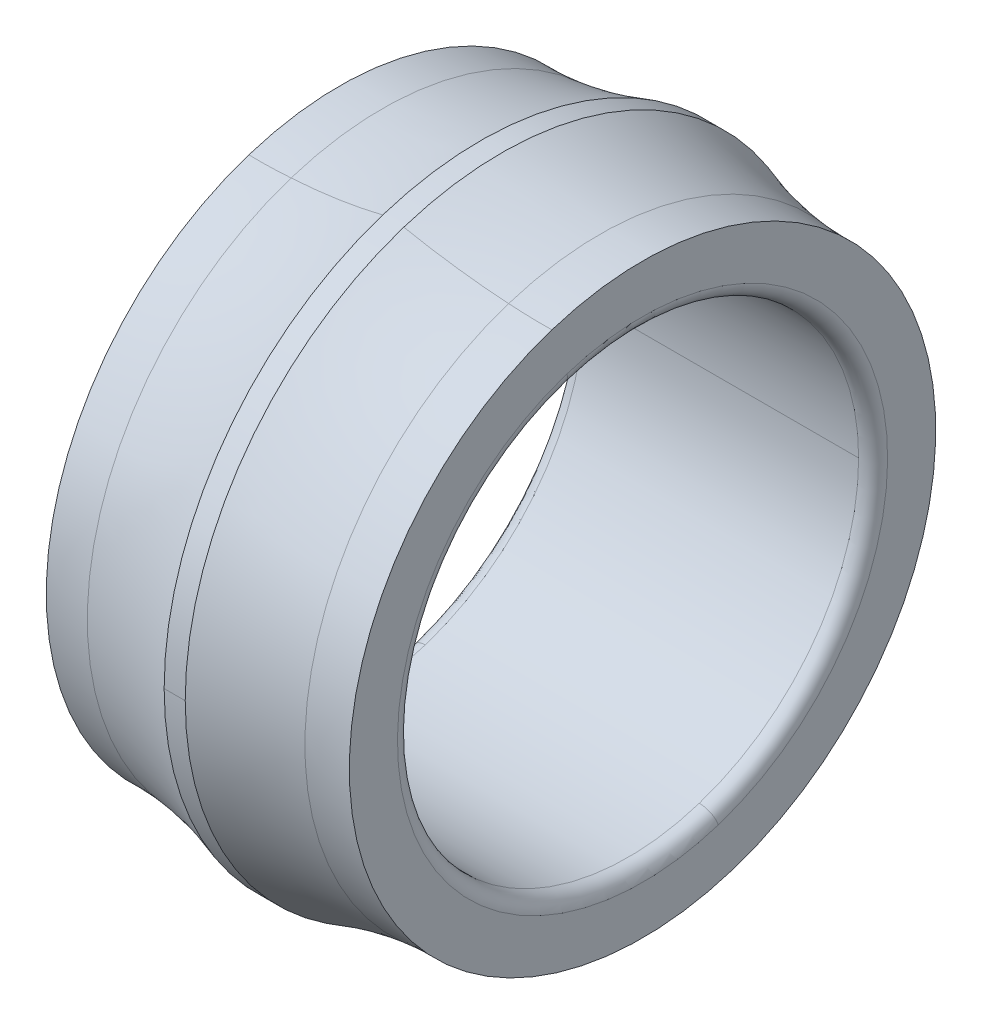
ISO-10303-21;
HEADER;
FILE_DESCRIPTION(('STEP AP214'),'2;1');
FILE_NAME('part.step','',(''),(''),'','','');
FILE_SCHEMA(('AUTOMOTIVE_DESIGN { 1 0 10303 214 1 1 1 1 }'));
ENDSEC;
DATA;
#1=APPLICATION_CONTEXT('core data for automotive mechanical design processes');
#2=APPLICATION_PROTOCOL_DEFINITION('international standard','automotive_design',2000,#1);
#3=PRODUCT_CONTEXT('',#1,'mechanical');
#4=PRODUCT('Part','Part','',(#3));
#5=PRODUCT_RELATED_PRODUCT_CATEGORY('part','',(#4));
#6=PRODUCT_DEFINITION_FORMATION('','',#4);
#7=PRODUCT_DEFINITION_CONTEXT('part definition',#1,'design');
#8=PRODUCT_DEFINITION('design','',#6,#7);
#9=PRODUCT_DEFINITION_SHAPE('','',#8);
#10=(LENGTH_UNIT() NAMED_UNIT(*) SI_UNIT(.MILLI.,.METRE.));
#11=(NAMED_UNIT(*) PLANE_ANGLE_UNIT() SI_UNIT($,.RADIAN.));
#12=(NAMED_UNIT(*) SI_UNIT($,.STERADIAN.) SOLID_ANGLE_UNIT());
#13=UNCERTAINTY_MEASURE_WITH_UNIT(LENGTH_MEASURE(1.E-05),#10,'distance_accuracy_value','');
#14=(GEOMETRIC_REPRESENTATION_CONTEXT(3) GLOBAL_UNCERTAINTY_ASSIGNED_CONTEXT((#13)) GLOBAL_UNIT_ASSIGNED_CONTEXT((#10,
#11,#12)) REPRESENTATION_CONTEXT('',''));
#15=CARTESIAN_POINT('',(0.,0.,0.));
#16=DIRECTION('',(0.,0.,1.));
#17=DIRECTION('',(1.,0.,0.));
#18=AXIS2_PLACEMENT_3D('',#15,#16,#17);
#19=CARTESIAN_POINT('',(0.,22.25,0.));
#20=DIRECTION('',(-1.,0.,0.));
#21=DIRECTION('',(0.,0.,1.));
#22=AXIS2_PLACEMENT_3D('',#19,#20,#21);
#23=PLANE('',#22);
#24=CARTESIAN_POINT('',(0.,0.,0.));
#25=DIRECTION('',(1.,0.,0.));
#26=DIRECTION('',(0.,0.,-1.));
#27=AXIS2_PLACEMENT_3D('',#24,#25,#26);
#28=CIRCLE('',#27,18.6);
#29=CARTESIAN_POINT('',(0.,17.6896512030902,5.74771609537413));
#30=VERTEX_POINT('',#29);
#31=CARTESIAN_POINT('',(0.,-17.6896512030902,-5.74771609537413));
#32=VERTEX_POINT('',#31);
#33=EDGE_CURVE('E11',#30,#32,#28,.T.);
#34=ORIENTED_EDGE('',*,*,#33,.T.);
#35=CARTESIAN_POINT('',(0.,-17.6896512030899,-5.74771609537402));
#36=CARTESIAN_POINT('',(0.,-16.7867653998321,-8.52637400922722));
#37=CARTESIAN_POINT('',(0.,-15.3385161051234,-11.1279192221512));
#38=CARTESIAN_POINT('',(0.,-13.3903241112692,-13.408836043617));
#39=CARTESIAN_POINT('',(0.,-8.70461316042848,-17.0837587172018));
#40=CARTESIAN_POINT('',(0.,-2.97734274849613,-18.7145319215939));
#41=CARTESIAN_POINT('',(0.,0.0130906277951703,-18.949889231922));
#42=CARTESIAN_POINT('',(0.,5.92494943547726,-18.2351193361642));
#43=CARTESIAN_POINT('',(0.,11.1278748827464,-15.338476908109));
#44=CARTESIAN_POINT('',(0.,13.408846748682,-13.3903362077559));
#45=CARTESIAN_POINT('',(0.,17.0837614039407,-8.70460788740662));
#46=CARTESIAN_POINT('',(0.,18.7145158430512,-2.97734119805316));
#47=CARTESIAN_POINT('',(0.,18.9499470050211,0.0130777958901866));
#48=CARTESIAN_POINT('',(0.,18.5924553872031,2.96903166185318));
#49=CARTESIAN_POINT('',(0.,17.6896512030899,5.74771609537402));
#50=B_SPLINE_CURVE_WITH_KNOTS('',5,(#35,#36,#37,#38,#39,#40,#41,#42,#43,#44,#45,#46,#47,#48,
#49),.UNSPECIFIED.,.F.,.F.,(6,3,3,3,6),(0.,0.785398163397448,1.5707963267949,2.35619449019234,
3.14159265358979),.UNSPECIFIED.);
#51=EDGE_CURVE('E25',#32,#30,#50,.T.);
#52=ORIENTED_EDGE('',*,*,#51,.T.);
#53=EDGE_LOOP('',(#34,#52));
#54=FACE_BOUND('',#53,.T.);
#55=CARTESIAN_POINT('',(0.,0.,0.));
#56=DIRECTION('',(1.,0.,0.));
#57=DIRECTION('',(0.,0.,-1.));
#58=AXIS2_PLACEMENT_3D('',#55,#56,#57);
#59=CIRCLE('',#58,22.25);
#60=CARTESIAN_POINT('',(0.,21.1610074875671,6.87562812484257));
#61=VERTEX_POINT('',#60);
#62=CARTESIAN_POINT('',(0.,-21.1610074875671,-6.87562812484257));
#63=VERTEX_POINT('',#62);
#64=EDGE_CURVE('E367',#61,#63,#59,.T.);
#65=ORIENTED_EDGE('',*,*,#64,.F.);
#66=CARTESIAN_POINT('',(0.,0.,0.));
#67=DIRECTION('',(1.,0.,0.));
#68=DIRECTION('',(0.,-0.951056516295154,-0.309016994374947));
#69=AXIS2_PLACEMENT_3D('',#66,#67,#68);
#70=CIRCLE('',#69,22.25);
#71=EDGE_CURVE('E362',#63,#61,#70,.T.);
#72=ORIENTED_EDGE('',*,*,#71,.F.);
#73=EDGE_LOOP('',(#65,#72));
#74=FACE_BOUND('',#73,.T.);
#75=ADVANCED_FACE('F16',(#54,#74),#23,.T.);
#76=CARTESIAN_POINT('',(0.707744054482949,0.,0.));
#77=DIRECTION('',(1.,0.,0.));
#78=DIRECTION('',(0.,-0.309016994374947,0.951056516295154));
#79=AXIS2_PLACEMENT_3D('',#76,#77,#78);
#80=TOROIDAL_SURFACE('',#79,45.2391082545753,22.9999999997226);
#81=CARTESIAN_POINT('',(0.707744054482949,-43.0249486968957,-13.9796532610317));
#82=DIRECTION('',(0.,0.309016994374947,-0.951056516295154));
#83=DIRECTION('',(-0.0307714806300624,0.95060613954749,0.308870658098906));
#84=AXIS2_PLACEMENT_3D('',#81,#82,#83);
#85=CIRCLE('',#84,22.9999999997226);
#86=CARTESIAN_POINT('',(3.24507491838244,-21.2841638454209,-6.91564405122555));
#87=VERTEX_POINT('',#86);
#88=EDGE_CURVE('E357',#63,#87,#85,.T.);
#89=ORIENTED_EDGE('',*,*,#88,.F.);
#90=ORIENTED_EDGE('',*,*,#71,.T.);
#91=CARTESIAN_POINT('',(0.707744054482949,43.0249486968957,13.9796532610317));
#92=DIRECTION('',(0.,-0.309016994374947,0.951056516295154));
#93=DIRECTION('',(-0.0307714806300629,-0.95060613954749,-0.308870658098906));
#94=AXIS2_PLACEMENT_3D('',#91,#92,#93);
#95=CIRCLE('',#94,22.9999999997226);
#96=CARTESIAN_POINT('',(3.24507491838244,21.2841638454209,6.91564405122556));
#97=VERTEX_POINT('',#96);
#98=EDGE_CURVE('E353',#61,#97,#95,.T.);
#99=ORIENTED_EDGE('',*,*,#98,.T.);
#100=CARTESIAN_POINT('',(3.24507491838238,0.,0.));
#101=DIRECTION('',(1.,0.,0.));
#102=DIRECTION('',(0.,-0.951056516295154,-0.309016994374947));
#103=AXIS2_PLACEMENT_3D('',#100,#101,#102);
#104=CIRCLE('',#103,22.379494257958);
#105=EDGE_CURVE('E348',#87,#97,#104,.T.);
#106=ORIENTED_EDGE('',*,*,#105,.F.);
#107=EDGE_LOOP('',(#89,#90,#99,#106));
#108=FACE_BOUND('',#107,.T.);
#109=ADVANCED_FACE('F388',(#108),#80,.F.);
#110=CARTESIAN_POINT('',(0.137967408664856,0.,0.));
#111=DIRECTION('',(1.,0.,0.));
#112=DIRECTION('',(0.,-0.309016994374947,0.951056516295154));
#113=AXIS2_PLACEMENT_3D('',#110,#111,#112);
#114=TOROIDAL_SURFACE('',#113,54.5392466384352,32.3095000000086);
#115=CARTESIAN_POINT('',(0.137967408664856,-51.8699059093124,-16.8535540716832));
#116=DIRECTION('',(0.,0.309016994374947,-0.951056516295154));
#117=DIRECTION('',(0.0961669945284438,0.946648572831004,0.307584766723564));
#118=AXIS2_PLACEMENT_3D('',#115,#116,#117);
#119=CIRCLE('',#118,32.3095000000086);
#120=CARTESIAN_POINT('',(10.7001661655771,-22.8300567005585,-7.41793508812548));
#121=VERTEX_POINT('',#120);
#122=EDGE_CURVE('E343',#87,#121,#119,.T.);
#123=ORIENTED_EDGE('',*,*,#122,.F.);
#124=ORIENTED_EDGE('',*,*,#105,.T.);
#125=CARTESIAN_POINT('',(0.137967408664856,51.8699059093124,16.8535540716832));
#126=DIRECTION('',(0.,-0.309016994374947,0.951056516295154));
#127=DIRECTION('',(0.0961669945284437,-0.946648572831004,-0.307584766723564));
#128=AXIS2_PLACEMENT_3D('',#125,#126,#127);
#129=CIRCLE('',#128,32.3095000000086);
#130=CARTESIAN_POINT('',(10.700166165577,22.8300567005585,7.41793508812548));
#131=VERTEX_POINT('',#130);
#132=EDGE_CURVE('E339',#97,#131,#129,.T.);
#133=ORIENTED_EDGE('',*,*,#132,.T.);
#134=CARTESIAN_POINT('',(10.700166165577,0.,0.));
#135=DIRECTION('',(1.,0.,0.));
#136=DIRECTION('',(0.,0.,-1.));
#137=AXIS2_PLACEMENT_3D('',#134,#135,#136);
#138=CIRCLE('',#137,24.004942197855);
#139=CARTESIAN_POINT('',(10.700166165577,0.,-24.004942197855));
#140=VERTEX_POINT('',#139);
#141=EDGE_CURVE('E334',#140,#131,#138,.T.);
#142=ORIENTED_EDGE('',*,*,#141,.F.);
#143=CARTESIAN_POINT('',(10.700166165577,0.,0.));
#144=DIRECTION('',(1.,0.,0.));
#145=DIRECTION('',(0.,0.,-1.));
#146=AXIS2_PLACEMENT_3D('',#143,#144,#145);
#147=CIRCLE('',#146,24.004942197855);
#148=EDGE_CURVE('E329',#121,#140,#147,.T.);
#149=ORIENTED_EDGE('',*,*,#148,.F.);
#150=EDGE_LOOP('',(#123,#124,#133,#142,#149));
#151=FACE_BOUND('',#150,.T.);
#152=ADVANCED_FACE('F391',(#151),#114,.F.);
#153=CARTESIAN_POINT('',(23.,0.,0.));
#154=DIRECTION('',(1.,0.,0.));
#155=DIRECTION('',(0.,1.,0.));
#156=AXIS2_PLACEMENT_3D('',#153,#154,#155);
#157=CYLINDRICAL_SURFACE('',#156,24.004942197855);
#158=DIRECTION('',(1.,0.,0.));
#159=VECTOR('',#158,1.);
#160=CARTESIAN_POINT('',(10.700166165577,0.,24.004942197855));
#161=LINE('',#160,#159);
#162=CARTESIAN_POINT('',(10.700166165577,0.,24.004942197855));
#163=VERTEX_POINT('',#162);
#164=CARTESIAN_POINT('',(12.299833834423,0.,24.004942197855));
#165=VERTEX_POINT('',#164);
#166=EDGE_CURVE('E324',#163,#165,#161,.T.);
#167=ORIENTED_EDGE('',*,*,#166,.F.);
#168=CARTESIAN_POINT('',(10.700166165577,0.,0.));
#169=DIRECTION('',(1.,0.,0.));
#170=DIRECTION('',(0.,0.,-1.));
#171=AXIS2_PLACEMENT_3D('',#168,#169,#170);
#172=CIRCLE('',#171,24.004942197855);
#173=EDGE_CURVE('E319',#163,#121,#172,.T.);
#174=ORIENTED_EDGE('',*,*,#173,.T.);
#175=ORIENTED_EDGE('',*,*,#148,.T.);
#176=DIRECTION('',(1.,0.,0.));
#177=VECTOR('',#176,1.);
#178=CARTESIAN_POINT('',(10.700166165577,0.,-24.004942197855));
#179=LINE('',#178,#177);
#180=CARTESIAN_POINT('',(12.299833834423,0.,-24.004942197855));
#181=VERTEX_POINT('',#180);
#182=EDGE_CURVE('E315',#140,#181,#179,.T.);
#183=ORIENTED_EDGE('',*,*,#182,.T.);
#184=CARTESIAN_POINT('',(12.299833834423,0.,0.));
#185=DIRECTION('',(1.,0.,0.));
#186=DIRECTION('',(0.,0.,-1.));
#187=AXIS2_PLACEMENT_3D('',#184,#185,#186);
#188=CIRCLE('',#187,24.004942197855);
#189=CARTESIAN_POINT('',(12.299833834423,-22.8300567005585,-7.41793508812548));
#190=VERTEX_POINT('',#189);
#191=EDGE_CURVE('E310',#190,#181,#188,.T.);
#192=ORIENTED_EDGE('',*,*,#191,.F.);
#193=CARTESIAN_POINT('',(12.299833834423,0.,0.));
#194=DIRECTION('',(1.,0.,0.));
#195=DIRECTION('',(0.,0.,-1.));
#196=AXIS2_PLACEMENT_3D('',#193,#194,#195);
#197=CIRCLE('',#196,24.004942197855);
#198=EDGE_CURVE('E305',#165,#190,#197,.T.);
#199=ORIENTED_EDGE('',*,*,#198,.F.);
#200=EDGE_LOOP('',(#167,#174,#175,#183,#192,#199));
#201=FACE_BOUND('',#200,.T.);
#202=ADVANCED_FACE('F402',(#201),#157,.T.);
#203=CARTESIAN_POINT('',(22.8620325913374,0.,0.));
#204=DIRECTION('',(1.,0.,0.));
#205=DIRECTION('',(0.,0.309016994374947,-0.951056516295154));
#206=AXIS2_PLACEMENT_3D('',#203,#204,#205);
#207=TOROIDAL_SURFACE('',#206,54.5392466384428,32.3095000000165);
#208=CARTESIAN_POINT('',(22.8620325913374,-51.8699059093196,-16.8535540716855));
#209=DIRECTION('',(0.,0.309016994374947,-0.951056516295154));
#210=DIRECTION('',(-0.326906908398737,0.898802185386536,0.292038533049265));
#211=AXIS2_PLACEMENT_3D('',#208,#209,#210);
#212=CIRCLE('',#211,32.3095000000165);
#213=CARTESIAN_POINT('',(19.754925081616,-21.2841638454209,-6.91564405122557));
#214=VERTEX_POINT('',#213);
#215=EDGE_CURVE('E301',#190,#214,#212,.T.);
#216=ORIENTED_EDGE('',*,*,#215,.T.);
#217=CARTESIAN_POINT('',(19.754925081616,0.,0.));
#218=DIRECTION('',(1.,0.,0.));
#219=DIRECTION('',(0.,0.,-1.));
#220=AXIS2_PLACEMENT_3D('',#217,#218,#219);
#221=CIRCLE('',#220,22.379494257958);
#222=CARTESIAN_POINT('',(19.754925081616,21.2841638454209,6.91564405122557));
#223=VERTEX_POINT('',#222);
#224=EDGE_CURVE('E296',#223,#214,#221,.T.);
#225=ORIENTED_EDGE('',*,*,#224,.F.);
#226=CARTESIAN_POINT('',(22.8620325913374,51.8699059093196,16.8535540716855));
#227=DIRECTION('',(0.,-0.309016994374947,0.951056516295154));
#228=DIRECTION('',(-0.326906908398739,-0.898802185386535,-0.292038533049265));
#229=AXIS2_PLACEMENT_3D('',#226,#227,#228);
#230=CIRCLE('',#229,32.3095000000165);
#231=CARTESIAN_POINT('',(12.299833834423,22.8300567005585,7.41793508812548));
#232=VERTEX_POINT('',#231);
#233=EDGE_CURVE('E291',#232,#223,#230,.T.);
#234=ORIENTED_EDGE('',*,*,#233,.F.);
#235=CARTESIAN_POINT('',(12.299833834423,0.,0.));
#236=DIRECTION('',(1.,0.,0.));
#237=DIRECTION('',(0.,0.,-1.));
#238=AXIS2_PLACEMENT_3D('',#235,#236,#237);
#239=CIRCLE('',#238,24.004942197855);
#240=EDGE_CURVE('E286',#232,#165,#239,.T.);
#241=ORIENTED_EDGE('',*,*,#240,.T.);
#242=ORIENTED_EDGE('',*,*,#198,.T.);
#243=EDGE_LOOP('',(#216,#225,#234,#241,#242));
#244=FACE_BOUND('',#243,.T.);
#245=ADVANCED_FACE('F405',(#244),#207,.F.);
#246=CARTESIAN_POINT('',(23.,0.,0.));
#247=DIRECTION('',(1.,0.,0.));
#248=DIRECTION('',(0.,-1.,0.));
#249=AXIS2_PLACEMENT_3D('',#246,#247,#248);
#250=CYLINDRICAL_SURFACE('',#249,24.004942197855);
#251=ORIENTED_EDGE('',*,*,#166,.T.);
#252=ORIENTED_EDGE('',*,*,#240,.F.);
#253=CARTESIAN_POINT('',(12.299833834423,0.,0.));
#254=DIRECTION('',(1.,0.,0.));
#255=DIRECTION('',(0.,0.,-1.));
#256=AXIS2_PLACEMENT_3D('',#253,#254,#255);
#257=CIRCLE('',#256,24.004942197855);
#258=EDGE_CURVE('E281',#181,#232,#257,.T.);
#259=ORIENTED_EDGE('',*,*,#258,.F.);
#260=ORIENTED_EDGE('',*,*,#182,.F.);
#261=ORIENTED_EDGE('',*,*,#141,.T.);
#262=CARTESIAN_POINT('',(10.700166165577,0.,0.));
#263=DIRECTION('',(1.,0.,0.));
#264=DIRECTION('',(0.,0.,-1.));
#265=AXIS2_PLACEMENT_3D('',#262,#263,#264);
#266=CIRCLE('',#265,24.004942197855);
#267=EDGE_CURVE('E276',#131,#163,#266,.T.);
#268=ORIENTED_EDGE('',*,*,#267,.T.);
#269=EDGE_LOOP('',(#251,#252,#259,#260,#261,#268));
#270=FACE_BOUND('',#269,.T.);
#271=ADVANCED_FACE('F399',(#270),#250,.T.);
#272=CARTESIAN_POINT('',(0.137967408664856,0.,0.));
#273=DIRECTION('',(1.,0.,0.));
#274=DIRECTION('',(0.,0.309016994374947,-0.951056516295154));
#275=AXIS2_PLACEMENT_3D('',#272,#273,#274);
#276=TOROIDAL_SURFACE('',#275,54.5392466384352,32.3095000000086);
#277=ORIENTED_EDGE('',*,*,#122,.T.);
#278=ORIENTED_EDGE('',*,*,#173,.F.);
#279=ORIENTED_EDGE('',*,*,#267,.F.);
#280=ORIENTED_EDGE('',*,*,#132,.F.);
#281=CARTESIAN_POINT('',(3.24507491838238,0.,0.));
#282=DIRECTION('',(1.,0.,0.));
#283=DIRECTION('',(0.,0.,-1.));
#284=AXIS2_PLACEMENT_3D('',#281,#282,#283);
#285=CIRCLE('',#284,22.379494257958);
#286=EDGE_CURVE('E271',#97,#87,#285,.T.);
#287=ORIENTED_EDGE('',*,*,#286,.T.);
#288=EDGE_LOOP('',(#277,#278,#279,#280,#287));
#289=FACE_BOUND('',#288,.T.);
#290=ADVANCED_FACE('F396',(#289),#276,.F.);
#291=CARTESIAN_POINT('',(0.707744054482949,0.,0.));
#292=DIRECTION('',(1.,0.,0.));
#293=DIRECTION('',(0.,0.309016994374947,-0.951056516295154));
#294=AXIS2_PLACEMENT_3D('',#291,#292,#293);
#295=TOROIDAL_SURFACE('',#294,45.2391082545753,22.9999999997226);
#296=ORIENTED_EDGE('',*,*,#88,.T.);
#297=ORIENTED_EDGE('',*,*,#286,.F.);
#298=ORIENTED_EDGE('',*,*,#98,.F.);
#299=ORIENTED_EDGE('',*,*,#64,.T.);
#300=EDGE_LOOP('',(#296,#297,#298,#299));
#301=FACE_BOUND('',#300,.T.);
#302=ADVANCED_FACE('F384',(#301),#295,.F.);
#303=CARTESIAN_POINT('',(22.8620325913374,0.,0.));
#304=DIRECTION('',(1.,0.,0.));
#305=DIRECTION('',(0.,-0.309016994374947,0.951056516295154));
#306=AXIS2_PLACEMENT_3D('',#303,#304,#305);
#307=TOROIDAL_SURFACE('',#306,54.5392466384428,32.3095000000165);
#308=ORIENTED_EDGE('',*,*,#215,.F.);
#309=ORIENTED_EDGE('',*,*,#191,.T.);
#310=ORIENTED_EDGE('',*,*,#258,.T.);
#311=ORIENTED_EDGE('',*,*,#233,.T.);
#312=CARTESIAN_POINT('',(19.754925081616,0.,0.));
#313=DIRECTION('',(1.,0.,0.));
#314=DIRECTION('',(0.,-0.951056516295154,-0.309016994374947));
#315=AXIS2_PLACEMENT_3D('',#312,#313,#314);
#316=CIRCLE('',#315,22.379494257958);
#317=EDGE_CURVE('E266',#214,#223,#316,.T.);
#318=ORIENTED_EDGE('',*,*,#317,.F.);
#319=EDGE_LOOP('',(#308,#309,#310,#311,#318));
#320=FACE_BOUND('',#319,.T.);
#321=ADVANCED_FACE('F409',(#320),#307,.F.);
#322=CARTESIAN_POINT('',(22.2922559455175,0.,0.));
#323=DIRECTION('',(1.,0.,0.));
#324=DIRECTION('',(0.,-0.309016994374947,0.951056516295154));
#325=AXIS2_PLACEMENT_3D('',#322,#323,#324);
#326=TOROIDAL_SURFACE('',#325,45.2391082546171,22.9999999997644);
#327=CARTESIAN_POINT('',(22.2922559455175,-43.0249486969355,-13.9796532610446));
#328=DIRECTION('',(0.,0.309016994374947,-0.951056516295154));
#329=DIRECTION('',(-0.110318733214235,0.945251515292926,0.307130835212672));
#330=AXIS2_PLACEMENT_3D('',#327,#328,#329);
#331=CIRCLE('',#330,22.9999999997643);
#332=CARTESIAN_POINT('',(23.,-21.1610074875672,-6.87562812484257));
#333=VERTEX_POINT('',#332);
#334=EDGE_CURVE('E261',#214,#333,#331,.T.);
#335=ORIENTED_EDGE('',*,*,#334,.F.);
#336=ORIENTED_EDGE('',*,*,#317,.T.);
#337=CARTESIAN_POINT('',(22.2922559455175,43.0249486969355,13.9796532610446));
#338=DIRECTION('',(0.,-0.309016994374947,0.951056516295154));
#339=DIRECTION('',(-0.110318733214236,-0.945251515292926,-0.307130835212672));
#340=AXIS2_PLACEMENT_3D('',#337,#338,#339);
#341=CIRCLE('',#340,22.9999999997644);
#342=CARTESIAN_POINT('',(23.,21.1610074875672,6.87562812484257));
#343=VERTEX_POINT('',#342);
#344=EDGE_CURVE('E257',#223,#343,#341,.T.);
#345=ORIENTED_EDGE('',*,*,#344,.T.);
#346=CARTESIAN_POINT('',(23.,0.,0.));
#347=DIRECTION('',(1.,0.,0.));
#348=DIRECTION('',(0.,-0.951056516295154,-0.309016994374947));
#349=AXIS2_PLACEMENT_3D('',#346,#347,#348);
#350=CIRCLE('',#349,22.25);
#351=EDGE_CURVE('E252',#333,#343,#350,.T.);
#352=ORIENTED_EDGE('',*,*,#351,.F.);
#353=EDGE_LOOP('',(#335,#336,#345,#352));
#354=FACE_BOUND('',#353,.T.);
#355=ADVANCED_FACE('F413',(#354),#326,.F.);
#356=CARTESIAN_POINT('',(23.,18.6,0.));
#357=DIRECTION('',(1.,0.,0.));
#358=DIRECTION('',(0.,0.,-1.));
#359=AXIS2_PLACEMENT_3D('',#356,#357,#358);
#360=PLANE('',#359);
#361=CARTESIAN_POINT('',(23.,0.,0.));
#362=DIRECTION('',(1.,0.,0.));
#363=DIRECTION('',(0.,0.,-1.));
#364=AXIS2_PLACEMENT_3D('',#361,#362,#363);
#365=CIRCLE('',#364,22.25);
#366=EDGE_CURVE('E249',#343,#333,#365,.T.);
#367=ORIENTED_EDGE('',*,*,#366,.T.);
#368=ORIENTED_EDGE('',*,*,#351,.T.);
#369=EDGE_LOOP('',(#367,#368));
#370=FACE_BOUND('',#369,.T.);
#371=CARTESIAN_POINT('',(23.,-17.6896512030905,-5.74771609537427));
#372=CARTESIAN_POINT('',(23.,-17.5956104633095,-6.0371646235953));
#373=CARTESIAN_POINT('',(23.,-17.4944537525369,-6.32430045508391));
#374=CARTESIAN_POINT('',(23.,-17.2781786114769,-6.89326507254812));
#375=CARTESIAN_POINT('',(23.,-17.1630601811896,-7.17509385852372));
#376=CARTESIAN_POINT('',(23.,-16.9191318235691,-7.73276273291374));
#377=CARTESIAN_POINT('',(23.,-16.790321896236,-8.00860282132817));
#378=CARTESIAN_POINT('',(23.,-16.5193227634808,-8.55363050161192));
#379=CARTESIAN_POINT('',(23.,-16.3771335580587,-8.82281809348125));
#380=CARTESIAN_POINT('',(23.,-16.0797179050506,-9.3538920902062));
#381=CARTESIAN_POINT('',(23.,-15.9244914574645,-9.6157784950618));
#382=CARTESIAN_POINT('',(23.,-15.6013754109782,-10.1316192624487));
#383=CARTESIAN_POINT('',(23.,-15.4334858120778,-10.38557362498));
#384=CARTESIAN_POINT('',(23.,-15.0854478870724,-10.884938495488));
#385=CARTESIAN_POINT('',(23.,-14.9052995609672,-11.1303490034646));
#386=CARTESIAN_POINT('',(23.,-14.5331781844664,-11.6120349531859));
#387=CARTESIAN_POINT('',(23.,-14.3412051340707,-11.8483103949305));
#388=CARTESIAN_POINT('',(23.,-13.9458967862515,-12.3111570029533));
#389=CARTESIAN_POINT('',(23.,-13.7425614888279,-12.5377281692315));
#390=CARTESIAN_POINT('',(23.,-13.3250185001993,-12.9806203968046));
#391=CARTESIAN_POINT('',(23.,-13.1108108089943,-13.1969414580995));
#392=CARTESIAN_POINT('',(23.,-12.6720390777044,-13.6188123392501));
#393=CARTESIAN_POINT('',(23.,-12.4474750376195,-13.8243621591057));
#394=CARTESIAN_POINT('',(23.,-11.9885316030626,-14.2241953698769));
#395=CARTESIAN_POINT('',(23.,-11.7541522085905,-14.4184787607924));
#396=CARTESIAN_POINT('',(23.,-11.2761427057362,-14.7953110679724));
#397=CARTESIAN_POINT('',(23.,-11.0325125973539,-14.9778599842367));
#398=CARTESIAN_POINT('',(23.,-10.5365885929532,-15.330783565787));
#399=CARTESIAN_POINT('',(23.,-10.2842946969349,-15.5011582310729));
#400=CARTESIAN_POINT('',(23.,-9.77165091535505,-15.8293228631741));
#401=CARTESIAN_POINT('',(23.,-9.51130102979354,-15.9871128299895));
#402=CARTESIAN_POINT('',(23.,-8.98317247480588,-16.2897279352988));
#403=CARTESIAN_POINT('',(23.,-8.71539380537973,-16.4345530737928));
#404=CARTESIAN_POINT('',(23.,-8.17305278493202,-16.7108896260157));
#405=CARTESIAN_POINT('',(23.,-7.89849043391046,-16.8424010397446));
#406=CARTESIAN_POINT('',(23.,-7.34324349502436,-17.0917933199225));
#407=CARTESIAN_POINT('',(23.,-7.06255890715983,-17.2096741863715));
#408=CARTESIAN_POINT('',(23.,-6.49574368834503,-17.4315213866573));
#409=CARTESIAN_POINT('',(23.,-6.20961305739476,-17.535487720494));
#410=CARTESIAN_POINT('',(23.,-5.63259506616053,-17.7292553915507));
#411=CARTESIAN_POINT('',(23.,-5.34170770587656,-17.8190567287706));
#412=CARTESIAN_POINT('',(23.,-4.75587702910458,-17.9842780673065));
#413=CARTESIAN_POINT('',(23.,-4.46093371261657,-18.0596980686225));
#414=CARTESIAN_POINT('',(23.,-3.86770166771989,-18.1959750419614));
#415=CARTESIAN_POINT('',(23.,-3.56941293931123,-18.2568320139843));
#416=CARTESIAN_POINT('',(23.,-2.97020867424701,-18.363836318961));
#417=CARTESIAN_POINT('',(23.,-2.66929313759145,-18.4099836519148));
#418=CARTESIAN_POINT('',(23.,-2.06556018791832,-18.4874575057862));
#419=CARTESIAN_POINT('',(23.,-1.76274277490074,-18.5187840267038));
#420=CARTESIAN_POINT('',(23.,-1.15593558617521,-18.56654078817));
#421=CARTESIAN_POINT('',(23.,-0.851945810467258,-18.5829710287185));
#422=CARTESIAN_POINT('',(23.,-0.243526234357017,-18.6008956475581));
#423=CARTESIAN_POINT('',(23.,0.060903566045269,-18.602390025849));
#424=CARTESIAN_POINT('',(23.,0.669469793490115,-18.5904393200852));
#425=CARTESIAN_POINT('',(23.,0.973606220532675,-18.5769942360303));
#426=CARTESIAN_POINT('',(23.,1.58085300996611,-18.53519699596));
#427=CARTESIAN_POINT('',(23.,1.88396337235698,-18.5068448399445));
#428=CARTESIAN_POINT('',(23.,2.48842781307471,-18.4353017587801));
#429=CARTESIAN_POINT('',(23.,2.78978189140157,-18.3921108336312));
#430=CARTESIAN_POINT('',(23.,3.3900077756211,-18.2909942649216));
#431=CARTESIAN_POINT('',(23.,3.68887958151376,-18.2330686213609));
#432=CARTESIAN_POINT('',(23.,4.2834209125064,-18.1026221637769));
#433=CARTESIAN_POINT('',(23.,4.57909043760638,-18.0301013497536));
#434=CARTESIAN_POINT('',(23.,5.16651491323011,-17.8706392602373));
#435=CARTESIAN_POINT('',(23.,5.45826986375385,-17.7836979847444));
#436=CARTESIAN_POINT('',(23.,6.03716232699458,-17.5956044214367));
#437=CARTESIAN_POINT('',(23.,6.32429983971157,-17.4944521336219));
#438=CARTESIAN_POINT('',(23.,6.89326568792037,-17.2781802303919));
#439=CARTESIAN_POINT('',(23.,7.17509402341218,-17.1630606149766));
#440=CARTESIAN_POINT('',(23.,7.73276256802519,-16.9191313897822));
#441=CARTESIAN_POINT('',(23.,8.00860277714638,-16.7903217800031));
#442=CARTESIAN_POINT('',(23.,8.55363054579362,-16.5193228797137));
#443=CARTESIAN_POINT('',(23.,8.82281810531967,-16.3771335892032));
#444=CARTESIAN_POINT('',(23.,9.35389207836769,-16.0797178739061));
#445=CARTESIAN_POINT('',(23.,9.61577849188966,-15.9244914491194));
#446=CARTESIAN_POINT('',(23.,10.1316192656208,-15.6013754193233));
#447=CARTESIAN_POINT('',(23.,10.38557362583,-15.4334858143139));
#448=CARTESIAN_POINT('',(23.,10.884938494638,-15.0854478848363));
#449=CARTESIAN_POINT('',(23.,11.1303490032368,-14.9052995603681));
#450=CARTESIAN_POINT('',(23.,11.6120349534136,-14.5331781850656));
#451=CARTESIAN_POINT('',(23.,11.8483103949915,-14.3412051342313));
#452=CARTESIAN_POINT('',(23.,12.3111570028922,-13.945896786091));
#453=CARTESIAN_POINT('',(23.,12.5377281692151,-13.7425614887849));
#454=CARTESIAN_POINT('',(23.,12.9806203968209,-13.3250185002423));
#455=CARTESIAN_POINT('',(23.,13.1969414581039,-13.1108108090058));
#456=CARTESIAN_POINT('',(23.,13.6188123392457,-12.6720390776929));
#457=CARTESIAN_POINT('',(23.,13.8243621591045,-12.4474750376164));
#458=CARTESIAN_POINT('',(23.,14.224195369878,-11.9885316030657));
#459=CARTESIAN_POINT('',(23.,14.4184787607927,-11.7541522085914));
#460=CARTESIAN_POINT('',(23.,14.795311067972,-11.2761427057354));
#461=CARTESIAN_POINT('',(23.,14.9778599842366,-11.0325125973537));
#462=CARTESIAN_POINT('',(23.,15.3307835657871,-10.5365885929535));
#463=CARTESIAN_POINT('',(23.,15.5011582310729,-10.284294696935));
#464=CARTESIAN_POINT('',(23.,15.8293228631741,-9.77165091535504));
#465=CARTESIAN_POINT('',(23.,15.9871128299894,-9.51130102979358));
#466=CARTESIAN_POINT('',(23.,16.2897279352988,-8.98317247480595));
#467=CARTESIAN_POINT('',(23.,16.4345530737928,-8.71539380537979));
#468=CARTESIAN_POINT('',(23.,16.7108896260157,-8.17305278493207));
#469=CARTESIAN_POINT('',(23.,16.8424010397446,-7.89849043391051));
#470=CARTESIAN_POINT('',(23.,17.0917933199225,-7.34324349502441));
#471=CARTESIAN_POINT('',(23.,17.2096741863716,-7.06255890715986));
#472=CARTESIAN_POINT('',(23.,17.4315213866572,-6.4957436883451));
#473=CARTESIAN_POINT('',(23.,17.5354877204938,-6.20961305739487));
#474=CARTESIAN_POINT('',(23.,17.7292553915509,-5.63259506616051));
#475=CARTESIAN_POINT('',(23.,17.8190567287714,-5.34170770587638));
#476=CARTESIAN_POINT('',(23.,17.9842780673056,-4.75587702910486));
#477=CARTESIAN_POINT('',(23.,18.0596980686193,-4.46093371261748));
#478=CARTESIAN_POINT('',(23.,18.1959750419646,-3.86770166771908));
#479=CARTESIAN_POINT('',(23.,18.2568320139962,-3.56941293930805));
#480=CARTESIAN_POINT('',(23.,18.3638363189491,-2.97020867425029));
#481=CARTESIAN_POINT('',(23.,18.4099836518704,-2.66929313760356));
#482=CARTESIAN_POINT('',(23.,18.4874575058306,-2.06556018790631));
#483=CARTESIAN_POINT('',(23.,18.5187840268696,-1.7627427748558));
#484=CARTESIAN_POINT('',(23.,18.5665407880042,-1.15593558622027));
#485=CARTESIAN_POINT('',(23.,18.5829710280999,-0.851945810635244));
#486=CARTESIAN_POINT('',(23.,18.6008956481767,-0.243526234189159));
#487=CARTESIAN_POINT('',(23.,18.6023900281577,0.0609035666719037));
#488=CARTESIAN_POINT('',(23.,18.5904393177766,0.669469792863356));
#489=CARTESIAN_POINT('',(23.,18.5769942274145,0.973606218193746));
#490=CARTESIAN_POINT('',(23.,18.5351970045759,1.58085301230491));
#491=CARTESIAN_POINT('',(23.,18.5068448720995,1.88396338108569));
#492=CARTESIAN_POINT('',(23.,18.4353017266252,2.48842780434591));
#493=CARTESIAN_POINT('',(23.,18.3921107136274,2.78978185882535));
#494=CARTESIAN_POINT('',(23.,18.2909943849253,3.39000780819723));
#495=CARTESIAN_POINT('',(23.,18.233069069221,3.68887970308968));
#496=CARTESIAN_POINT('',(23.,18.1026217159169,4.28342079093038));
#497=CARTESIAN_POINT('',(23.,18.0300996783171,4.57908998387864));
#498=CARTESIAN_POINT('',(23.,17.8706409316738,5.16651536695775));
#499=CARTESIAN_POINT('',(23.,17.7837042226302,5.45827155708861));
#500=CARTESIAN_POINT('',(23.,17.6896512030905,5.74771609537417));
#501=B_SPLINE_CURVE_WITH_KNOTS('',3,(#371,#372,#373,#374,#375,#376,#377,#378,#379,#380,#381,
#382,#383,#384,#385,#386,#387,#388,#389,#390,#391,#392,#393,#394,#395,#396,#397,#398,#399,#400,
#401,#402,#403,#404,#405,#406,#407,#408,#409,#410,#411,#412,#413,#414,#415,#416,#417,#418,#419,
#420,#421,#422,#423,#424,#425,#426,#427,#428,#429,#430,#431,#432,#433,#434,#435,#436,#437,#438,
#439,#440,#441,#442,#443,#444,#445,#446,#447,#448,#449,#450,#451,#452,#453,#454,#455,#456,#457,
#458,#459,#460,#461,#462,#463,#464,#465,#466,#467,#468,#469,#470,#471,#472,#473,#474,#475,#476,
#477,#478,#479,#480,#481,#482,#483,#484,#485,#486,#487,#488,#489,#490,#491,#492,#493,#494,#495,
#496,#497,#498,#499,#500),.UNSPECIFIED.,.F.,.F.,(4,2,2,2,2,2,2,2,2,2,2,2,2,2,2,2,2,2,2,2,2,2,2,
2,2,2,2,2,2,2,2,2,2,2,2,2,2,2,2,2,2,2,2,2,2,2,2,2,2,2,2,2,2,2,2,2,2,2,2,2,2,2,2,2,4),(0.,
0.912933701052368,1.82586740210474,2.73880110315711,3.65173480420948,4.56466850526185,
5.47760220631422,6.39053590736659,7.30346960841896,8.21640330947133,9.12933701052369,
10.0422707115761,10.9552044126284,11.8681381136808,12.7810718147332,13.6940055157855,
14.6069392168379,15.5198729178903,16.4328066189427,17.345740319995,18.2586740210474,
19.1716077220998,20.0845414231521,20.9974751242045,21.9104088252569,22.8233425263093,
23.7362762273616,24.649209928414,25.5621436294663,26.4750773305187,27.3880110315711,
28.3009447326235,29.2138784336758,30.1268121347282,31.0397458357806,31.9526795368329,
32.8656132378853,33.7785469389377,34.6914806399901,35.6044143410424,36.5173480420948,
37.4302817431472,38.3432154441995,39.2561491452519,40.1690828463043,41.0820165473566,
41.994950248409,42.9078839494614,43.8208176505137,44.7337513515661,45.6466850526185,
46.5596187536709,47.4725524547232,48.3854861557756,49.298419856828,50.2113535578803,
51.1242872589327,52.037220959985,52.9501546610374,53.8630883620898,54.7760220631422,
55.6889557641945,56.6018894652469,57.5148231662993,58.4277568673516),.UNSPECIFIED.);
#502=CARTESIAN_POINT('',(23.,-17.6896512030905,-5.74771609537423));
#503=VERTEX_POINT('',#502);
#504=CARTESIAN_POINT('',(23.,17.6896512030905,5.74771609537424));
#505=VERTEX_POINT('',#504);
#506=EDGE_CURVE('E248',#503,#505,#501,.T.);
#507=ORIENTED_EDGE('',*,*,#506,.F.);
#508=CARTESIAN_POINT('',(23.,17.6896512030905,5.74771609537427));
#509=CARTESIAN_POINT('',(23.,17.5956104633095,6.0371646235953));
#510=CARTESIAN_POINT('',(23.,17.4944537525369,6.32430045508391));
#511=CARTESIAN_POINT('',(23.,17.2781786114769,6.89326507254812));
#512=CARTESIAN_POINT('',(23.,17.1630601811896,7.17509385852372));
#513=CARTESIAN_POINT('',(23.,16.9191318235691,7.73276273291374));
#514=CARTESIAN_POINT('',(23.,16.790321896236,8.00860282132817));
#515=CARTESIAN_POINT('',(23.,16.5193227634808,8.55363050161193));
#516=CARTESIAN_POINT('',(23.,16.3771335580587,8.82281809348126));
#517=CARTESIAN_POINT('',(23.,16.0797179050506,9.3538920902062));
#518=CARTESIAN_POINT('',(23.,15.9244914574645,9.61577849506181));
#519=CARTESIAN_POINT('',(23.,15.6013754109782,10.1316192624487));
#520=CARTESIAN_POINT('',(23.,15.4334858120778,10.38557362498));
#521=CARTESIAN_POINT('',(23.,15.0854478870724,10.884938495488));
#522=CARTESIAN_POINT('',(23.,14.9052995609672,11.1303490034646));
#523=CARTESIAN_POINT('',(23.,14.5331781844664,11.6120349531859));
#524=CARTESIAN_POINT('',(23.,14.3412051340707,11.8483103949305));
#525=CARTESIAN_POINT('',(23.,13.9458967862515,12.3111570029533));
#526=CARTESIAN_POINT('',(23.,13.7425614888279,12.5377281692315));
#527=CARTESIAN_POINT('',(23.,13.3250185001993,12.9806203968046));
#528=CARTESIAN_POINT('',(23.,13.1108108089942,13.1969414580995));
#529=CARTESIAN_POINT('',(23.,12.6720390777043,13.6188123392501));
#530=CARTESIAN_POINT('',(23.,12.4474750376195,13.8243621591057));
#531=CARTESIAN_POINT('',(23.,11.9885316030625,14.2241953698769));
#532=CARTESIAN_POINT('',(23.,11.7541522085905,14.4184787607925));
#533=CARTESIAN_POINT('',(23.,11.2761427057362,14.7953110679724));
#534=CARTESIAN_POINT('',(23.,11.0325125973539,14.9778599842368));
#535=CARTESIAN_POINT('',(23.,10.5365885929532,15.330783565787));
#536=CARTESIAN_POINT('',(23.,10.2842946969349,15.5011582310729));
#537=CARTESIAN_POINT('',(23.,9.77165091535504,15.8293228631741));
#538=CARTESIAN_POINT('',(23.,9.51130102979353,15.9871128299895));
#539=CARTESIAN_POINT('',(23.,8.98317247480587,16.2897279352988));
#540=CARTESIAN_POINT('',(23.,8.71539380537973,16.4345530737928));
#541=CARTESIAN_POINT('',(23.,8.17305278493201,16.7108896260157));
#542=CARTESIAN_POINT('',(23.,7.89849043391045,16.8424010397446));
#543=CARTESIAN_POINT('',(23.,7.34324349502435,17.0917933199225));
#544=CARTESIAN_POINT('',(23.,7.06255890715982,17.2096741863715));
#545=CARTESIAN_POINT('',(23.,6.49574368834502,17.4315213866573));
#546=CARTESIAN_POINT('',(23.,6.20961305739475,17.535487720494));
#547=CARTESIAN_POINT('',(23.,5.63259506616051,17.7292553915507));
#548=CARTESIAN_POINT('',(23.,5.34170770587655,17.8190567287706));
#549=CARTESIAN_POINT('',(23.,4.75587702910456,17.9842780673065));
#550=CARTESIAN_POINT('',(23.,4.46093371261655,18.0596980686225));
#551=CARTESIAN_POINT('',(23.,3.86770166771987,18.1959750419614));
#552=CARTESIAN_POINT('',(23.,3.56941293931121,18.2568320139843));
#553=CARTESIAN_POINT('',(23.,2.97020867424698,18.363836318961));
#554=CARTESIAN_POINT('',(23.,2.66929313759142,18.4099836519148));
#555=CARTESIAN_POINT('',(23.,2.06556018791828,18.4874575057862));
#556=CARTESIAN_POINT('',(23.,1.76274277490071,18.5187840267038));
#557=CARTESIAN_POINT('',(23.,1.15593558617519,18.56654078817));
#558=CARTESIAN_POINT('',(23.,0.851945810467237,18.5829710287185));
#559=CARTESIAN_POINT('',(23.,0.243526234356997,18.6008956475581));
#560=CARTESIAN_POINT('',(23.,-0.0609035660452921,18.602390025849));
#561=CARTESIAN_POINT('',(23.,-0.669469793490139,18.5904393200852));
#562=CARTESIAN_POINT('',(23.,-0.973606220532696,18.5769942360304));
#563=CARTESIAN_POINT('',(23.,-1.58085300996613,18.53519699596));
#564=CARTESIAN_POINT('',(23.,-1.883963372357,18.5068448399445));
#565=CARTESIAN_POINT('',(23.,-2.48842781307474,18.4353017587801));
#566=CARTESIAN_POINT('',(23.,-2.7897818914016,18.3921108336312));
#567=CARTESIAN_POINT('',(23.,-3.39000777562112,18.2909942649216));
#568=CARTESIAN_POINT('',(23.,-3.68887958151378,18.2330686213609));
#569=CARTESIAN_POINT('',(23.,-4.28342091250643,18.1026221637769));
#570=CARTESIAN_POINT('',(23.,-4.57909043760641,18.0301013497536));
#571=CARTESIAN_POINT('',(23.,-5.16651491323014,17.8706392602373));
#572=CARTESIAN_POINT('',(23.,-5.45826986375388,17.7836979847444));
#573=CARTESIAN_POINT('',(23.,-6.03716232699461,17.5956044214367));
#574=CARTESIAN_POINT('',(23.,-6.3242998397116,17.4944521336219));
#575=CARTESIAN_POINT('',(23.,-6.8932656879204,17.2781802303919));
#576=CARTESIAN_POINT('',(23.,-7.17509402341221,17.1630606149765));
#577=CARTESIAN_POINT('',(23.,-7.73276256802521,16.9191313897822));
#578=CARTESIAN_POINT('',(23.,-8.0086027771464,16.7903217800031));
#579=CARTESIAN_POINT('',(23.,-8.55363054579365,16.5193228797136));
#580=CARTESIAN_POINT('',(23.,-8.8228181053197,16.3771335892032));
#581=CARTESIAN_POINT('',(23.,-9.35389207836771,16.0797178739061));
#582=CARTESIAN_POINT('',(23.,-9.61577849188967,15.9244914491194));
#583=CARTESIAN_POINT('',(23.,-10.1316192656208,15.6013754193233));
#584=CARTESIAN_POINT('',(23.,-10.38557362583,15.4334858143139));
#585=CARTESIAN_POINT('',(23.,-10.884938494638,15.0854478848363));
#586=CARTESIAN_POINT('',(23.,-11.1303490032368,14.9052995603681));
#587=CARTESIAN_POINT('',(23.,-11.6120349534136,14.5331781850656));
#588=CARTESIAN_POINT('',(23.,-11.8483103949915,14.3412051342313));
#589=CARTESIAN_POINT('',(23.,-12.3111570028923,13.9458967860909));
#590=CARTESIAN_POINT('',(23.,-12.5377281692152,13.7425614887849));
#591=CARTESIAN_POINT('',(23.,-12.980620396821,13.3250185002423));
#592=CARTESIAN_POINT('',(23.,-13.1969414581039,13.1108108090058));
#593=CARTESIAN_POINT('',(23.,-13.6188123392457,12.6720390776928));
#594=CARTESIAN_POINT('',(23.,-13.8243621591045,12.4474750376164));
#595=CARTESIAN_POINT('',(23.,-14.2241953698781,11.9885316030657));
#596=CARTESIAN_POINT('',(23.,-14.4184787607928,11.7541522085914));
#597=CARTESIAN_POINT('',(23.,-14.795311067972,11.2761427057354));
#598=CARTESIAN_POINT('',(23.,-14.9778599842366,11.0325125973537));
#599=CARTESIAN_POINT('',(23.,-15.3307835657871,10.5365885929535));
#600=CARTESIAN_POINT('',(23.,-15.5011582310729,10.284294696935));
#601=CARTESIAN_POINT('',(23.,-15.8293228631741,9.771650915355));
#602=CARTESIAN_POINT('',(23.,-15.9871128299894,9.51130102979354));
#603=CARTESIAN_POINT('',(23.,-16.2897279352988,8.98317247480591));
#604=CARTESIAN_POINT('',(23.,-16.4345530737928,8.71539380537974));
#605=CARTESIAN_POINT('',(23.,-16.7108896260157,8.17305278493203));
#606=CARTESIAN_POINT('',(23.,-16.8424010397446,7.89849043391047));
#607=CARTESIAN_POINT('',(23.,-17.0917933199225,7.34324349502438));
#608=CARTESIAN_POINT('',(23.,-17.2096741863716,7.06255890715983));
#609=CARTESIAN_POINT('',(23.,-17.4315213866572,6.49574368834507));
#610=CARTESIAN_POINT('',(23.,-17.5354877204938,6.20961305739484));
#611=CARTESIAN_POINT('',(23.,-17.7292553915509,5.63259506616048));
#612=CARTESIAN_POINT('',(23.,-17.8190567287714,5.34170770587634));
#613=CARTESIAN_POINT('',(23.,-17.9842780673056,4.75587702910481));
#614=CARTESIAN_POINT('',(23.,-18.0596980686193,4.46093371261743));
#615=CARTESIAN_POINT('',(23.,-18.1959750419646,3.86770166771903));
#616=CARTESIAN_POINT('',(23.,-18.2568320139962,3.569412939308));
#617=CARTESIAN_POINT('',(23.,-18.3638363189491,2.97020867425024));
#618=CARTESIAN_POINT('',(23.,-18.4099836518704,2.66929313760351));
#619=CARTESIAN_POINT('',(23.,-18.4874575058306,2.06556018790626));
#620=CARTESIAN_POINT('',(23.,-18.5187840268696,1.76274277485575));
#621=CARTESIAN_POINT('',(23.,-18.5665407880042,1.15593558622022));
#622=CARTESIAN_POINT('',(23.,-18.5829710280999,0.851945810635193));
#623=CARTESIAN_POINT('',(23.,-18.6008956481767,0.243526234189107));
#624=CARTESIAN_POINT('',(23.,-18.6023900281577,-0.0609035666719556));
#625=CARTESIAN_POINT('',(23.,-18.5904393177766,-0.669469792863408));
#626=CARTESIAN_POINT('',(23.,-18.5769942274145,-0.973606218193797));
#627=CARTESIAN_POINT('',(23.,-18.5351970045759,-1.58085301230496));
#628=CARTESIAN_POINT('',(23.,-18.5068448720994,-1.88396338108574));
#629=CARTESIAN_POINT('',(23.,-18.4353017266252,-2.48842780434596));
#630=CARTESIAN_POINT('',(23.,-18.3921107136274,-2.7897818588254));
#631=CARTESIAN_POINT('',(23.,-18.2909943849253,-3.39000780819729));
#632=CARTESIAN_POINT('',(23.,-18.233069069221,-3.68887970308973));
#633=CARTESIAN_POINT('',(23.,-18.1026217159169,-4.28342079093043));
#634=CARTESIAN_POINT('',(23.,-18.0300996783171,-4.57908998387869));
#635=CARTESIAN_POINT('',(23.,-17.8706409316738,-5.1665153669578));
#636=CARTESIAN_POINT('',(23.,-17.7837042226302,-5.45827155708866));
#637=CARTESIAN_POINT('',(23.,-17.6896512030905,-5.74771609537422));
#638=B_SPLINE_CURVE_WITH_KNOTS('',3,(#508,#509,#510,#511,#512,#513,#514,#515,#516,#517,#518,
#519,#520,#521,#522,#523,#524,#525,#526,#527,#528,#529,#530,#531,#532,#533,#534,#535,#536,#537,
#538,#539,#540,#541,#542,#543,#544,#545,#546,#547,#548,#549,#550,#551,#552,#553,#554,#555,#556,
#557,#558,#559,#560,#561,#562,#563,#564,#565,#566,#567,#568,#569,#570,#571,#572,#573,#574,#575,
#576,#577,#578,#579,#580,#581,#582,#583,#584,#585,#586,#587,#588,#589,#590,#591,#592,#593,#594,
#595,#596,#597,#598,#599,#600,#601,#602,#603,#604,#605,#606,#607,#608,#609,#610,#611,#612,#613,
#614,#615,#616,#617,#618,#619,#620,#621,#622,#623,#624,#625,#626,#627,#628,#629,#630,#631,#632,
#633,#634,#635,#636,#637),.UNSPECIFIED.,.F.,.F.,(4,2,2,2,2,2,2,2,2,2,2,2,2,2,2,2,2,2,2,2,2,2,2,
2,2,2,2,2,2,2,2,2,2,2,2,2,2,2,2,2,2,2,2,2,2,2,2,2,2,2,2,2,2,2,2,2,2,2,2,2,2,2,2,2,4),(0.,
0.912933701052367,1.82586740210474,2.73880110315711,3.65173480420948,4.56466850526185,
5.47760220631423,6.39053590736659,7.30346960841897,8.21640330947134,9.1293370105237,
10.0422707115761,10.9552044126285,11.8681381136808,12.7810718147332,13.6940055157856,
14.6069392168379,15.5198729178903,16.4328066189427,17.345740319995,18.2586740210474,
19.1716077220998,20.0845414231522,20.9974751242045,21.9104088252569,22.8233425263093,
23.7362762273616,24.649209928414,25.5621436294664,26.4750773305187,27.3880110315711,
28.3009447326235,29.2138784336759,30.1268121347282,31.0397458357806,31.952679536833,
32.8656132378853,33.7785469389377,34.6914806399901,35.6044143410425,36.5173480420948,
37.4302817431472,38.3432154441996,39.2561491452519,40.1690828463043,41.0820165473567,
41.994950248409,42.9078839494614,43.8208176505138,44.7337513515662,45.6466850526185,
46.5596187536709,47.4725524547233,48.3854861557756,49.298419856828,50.2113535578804,
51.1242872589327,52.0372209599851,52.9501546610375,53.8630883620898,54.7760220631422,
55.6889557641946,56.601889465247,57.5148231662993,58.4277568673517),.UNSPECIFIED.);
#639=EDGE_CURVE('E211',#505,#503,#638,.T.);
#640=ORIENTED_EDGE('',*,*,#639,.F.);
#641=EDGE_LOOP('',(#507,#640));
#642=FACE_BOUND('',#641,.T.);
#643=ADVANCED_FACE('F196',(#370,#642),#360,.T.);
#644=CARTESIAN_POINT('',(21.8999999999993,0.,0.));
#645=DIRECTION('',(1.,0.,0.));
#646=DIRECTION('',(0.,0.309016994374947,-0.951056516295154));
#647=AXIS2_PLACEMENT_3D('',#644,#645,#646);
#648=TOROIDAL_SURFACE('',#647,18.6000000000007,1.10000000000069);
#649=CARTESIAN_POINT('',(21.8999999999993,-17.6896512030905,-5.74771609537423));
#650=DIRECTION('',(0.,0.309016994374948,-0.951056516295154));
#651=DIRECTION('',(6.39488462183692E-13,0.951056516295154,0.309016994374948));
#652=AXIS2_PLACEMENT_3D('',#649,#650,#651);
#653=CIRCLE('',#652,1.10000000000069);
#654=CARTESIAN_POINT('',(21.9,-16.6434890351652,-5.40779740156158));
#655=VERTEX_POINT('',#654);
#656=EDGE_CURVE('E222',#655,#503,#653,.T.);
#657=ORIENTED_EDGE('',*,*,#656,.F.);
#658=CARTESIAN_POINT('',(21.9,0.,0.));
#659=DIRECTION('',(1.,0.,0.));
#660=DIRECTION('',(0.,0.,-1.));
#661=AXIS2_PLACEMENT_3D('',#658,#659,#660);
#662=CIRCLE('',#661,17.5);
#663=CARTESIAN_POINT('',(21.9,0.,17.5));
#664=VERTEX_POINT('',#663);
#665=EDGE_CURVE('E217',#664,#655,#662,.T.);
#666=ORIENTED_EDGE('',*,*,#665,.F.);
#667=CARTESIAN_POINT('',(21.9,0.,0.));
#668=DIRECTION('',(1.,0.,0.));
#669=DIRECTION('',(0.,0.,-1.));
#670=AXIS2_PLACEMENT_3D('',#667,#668,#669);
#671=CIRCLE('',#670,17.5);
#672=CARTESIAN_POINT('',(21.9,16.6434890351652,5.40779740156158));
#673=VERTEX_POINT('',#672);
#674=EDGE_CURVE('E213',#673,#664,#671,.T.);
#675=ORIENTED_EDGE('',*,*,#674,.F.);
#676=CARTESIAN_POINT('',(21.8999999999993,17.6896512030905,5.74771609537424));
#677=DIRECTION('',(0.,-0.309016994374948,0.951056516295154));
#678=DIRECTION('',(6.36258722475693E-13,-0.951056516295154,-0.309016994374948));
#679=AXIS2_PLACEMENT_3D('',#676,#677,#678);
#680=CIRCLE('',#679,1.10000000000069);
#681=EDGE_CURVE('E170',#673,#505,#680,.T.);
#682=ORIENTED_EDGE('',*,*,#681,.T.);
#683=ORIENTED_EDGE('',*,*,#639,.T.);
#684=EDGE_LOOP('',(#657,#666,#675,#682,#683));
#685=FACE_BOUND('',#684,.T.);
#686=ADVANCED_FACE('F190',(#685),#648,.T.);
#687=CARTESIAN_POINT('',(21.8999999999993,0.,0.));
#688=DIRECTION('',(1.,0.,0.));
#689=DIRECTION('',(0.,-0.309016994374947,0.951056516295154));
#690=AXIS2_PLACEMENT_3D('',#687,#688,#689);
#691=TOROIDAL_SURFACE('',#690,18.6000000000007,1.10000000000069);
#692=ORIENTED_EDGE('',*,*,#656,.T.);
#693=ORIENTED_EDGE('',*,*,#506,.T.);
#694=ORIENTED_EDGE('',*,*,#681,.F.);
#695=CARTESIAN_POINT('',(21.9,0.,0.));
#696=DIRECTION('',(1.,0.,0.));
#697=DIRECTION('',(0.,0.,-1.));
#698=AXIS2_PLACEMENT_3D('',#695,#696,#697);
#699=CIRCLE('',#698,17.5);
#700=CARTESIAN_POINT('',(21.9,0.,-17.5));
#701=VERTEX_POINT('',#700);
#702=EDGE_CURVE('E165',#701,#673,#699,.T.);
#703=ORIENTED_EDGE('',*,*,#702,.F.);
#704=CARTESIAN_POINT('',(21.9,0.,0.));
#705=DIRECTION('',(1.,0.,0.));
#706=DIRECTION('',(0.,0.,-1.));
#707=AXIS2_PLACEMENT_3D('',#704,#705,#706);
#708=CIRCLE('',#707,17.5);
#709=EDGE_CURVE('E160',#655,#701,#708,.T.);
#710=ORIENTED_EDGE('',*,*,#709,.F.);
#711=EDGE_LOOP('',(#692,#693,#694,#703,#710));
#712=FACE_BOUND('',#711,.T.);
#713=ADVANCED_FACE('F179',(#712),#691,.T.);
#714=CARTESIAN_POINT('',(23.,0.,0.));
#715=DIRECTION('',(1.,0.,0.));
#716=DIRECTION('',(0.,1.,0.));
#717=AXIS2_PLACEMENT_3D('',#714,#715,#716);
#718=CYLINDRICAL_SURFACE('',#717,17.5);
#719=DIRECTION('',(1.,0.,0.));
#720=VECTOR('',#719,1.);
#721=CARTESIAN_POINT('',(1.1,0.,17.5));
#722=LINE('',#721,#720);
#723=CARTESIAN_POINT('',(1.1,0.,17.5));
#724=VERTEX_POINT('',#723);
#725=EDGE_CURVE('E136',#724,#664,#722,.T.);
#726=ORIENTED_EDGE('',*,*,#725,.T.);
#727=ORIENTED_EDGE('',*,*,#665,.T.);
#728=ORIENTED_EDGE('',*,*,#709,.T.);
#729=DIRECTION('',(1.,0.,0.));
#730=VECTOR('',#729,1.);
#731=CARTESIAN_POINT('',(1.1,0.,-17.5));
#732=LINE('',#731,#730);
#733=CARTESIAN_POINT('',(1.1,0.,-17.5));
#734=VERTEX_POINT('',#733);
#735=EDGE_CURVE('E153',#734,#701,#732,.T.);
#736=ORIENTED_EDGE('',*,*,#735,.F.);
#737=CARTESIAN_POINT('',(1.1,0.,0.));
#738=DIRECTION('',(1.,0.,0.));
#739=DIRECTION('',(0.,0.,-1.));
#740=AXIS2_PLACEMENT_3D('',#737,#738,#739);
#741=CIRCLE('',#740,17.5);
#742=CARTESIAN_POINT('',(1.1,-16.6434890351652,-5.40779740156158));
#743=VERTEX_POINT('',#742);
#744=EDGE_CURVE('E128',#743,#734,#741,.T.);
#745=ORIENTED_EDGE('',*,*,#744,.F.);
#746=CARTESIAN_POINT('',(1.1,0.,0.));
#747=DIRECTION('',(1.,0.,0.));
#748=DIRECTION('',(0.,0.,-1.));
#749=AXIS2_PLACEMENT_3D('',#746,#747,#748);
#750=CIRCLE('',#749,17.5);
#751=EDGE_CURVE('E146',#724,#743,#750,.T.);
#752=ORIENTED_EDGE('',*,*,#751,.F.);
#753=EDGE_LOOP('',(#726,#727,#728,#736,#745,#752));
#754=FACE_BOUND('',#753,.T.);
#755=ADVANCED_FACE('F189',(#754),#718,.F.);
#756=CARTESIAN_POINT('',(1.10000000000035,0.,0.));
#757=DIRECTION('',(1.,0.,0.));
#758=DIRECTION('',(0.,0.309016994374947,-0.951056516295154));
#759=AXIS2_PLACEMENT_3D('',#756,#757,#758);
#760=TOROIDAL_SURFACE('',#759,18.6000000000003,1.10000000000035);
#761=CARTESIAN_POINT('',(1.10000000000035,-17.6896512030902,-5.74771609537413));
#762=DIRECTION('',(0.,0.309016994374947,-0.951056516295154));
#763=DIRECTION('',(-1.,0.,0.));
#764=AXIS2_PLACEMENT_3D('',#761,#762,#763);
#765=CIRCLE('',#764,1.10000000000035);
#766=EDGE_CURVE('E121',#32,#743,#765,.T.);
#767=ORIENTED_EDGE('',*,*,#766,.F.);
#768=ORIENTED_EDGE('',*,*,#33,.F.);
#769=CARTESIAN_POINT('',(1.10000000000035,17.6896512030902,5.74771609537413));
#770=DIRECTION('',(0.,-0.309016994374947,0.951056516295154));
#771=DIRECTION('',(-1.,0.,0.));
#772=AXIS2_PLACEMENT_3D('',#769,#770,#771);
#773=CIRCLE('',#772,1.10000000000035);
#774=CARTESIAN_POINT('',(1.1,16.6434890351652,5.40779740156158));
#775=VERTEX_POINT('',#774);
#776=EDGE_CURVE('E114',#30,#775,#773,.T.);
#777=ORIENTED_EDGE('',*,*,#776,.T.);
#778=CARTESIAN_POINT('',(1.1,0.,0.));
#779=DIRECTION('',(1.,0.,0.));
#780=DIRECTION('',(0.,0.,-1.));
#781=AXIS2_PLACEMENT_3D('',#778,#779,#780);
#782=CIRCLE('',#781,17.5);
#783=EDGE_CURVE('E119',#775,#724,#782,.T.);
#784=ORIENTED_EDGE('',*,*,#783,.T.);
#785=ORIENTED_EDGE('',*,*,#751,.T.);
#786=EDGE_LOOP('',(#767,#768,#777,#784,#785));
#787=FACE_BOUND('',#786,.T.);
#788=ADVANCED_FACE('F116',(#787),#760,.T.);
#789=CARTESIAN_POINT('',(23.,0.,0.));
#790=DIRECTION('',(1.,0.,0.));
#791=DIRECTION('',(0.,-1.,0.));
#792=AXIS2_PLACEMENT_3D('',#789,#790,#791);
#793=CYLINDRICAL_SURFACE('',#792,17.5);
#794=ORIENTED_EDGE('',*,*,#725,.F.);
#795=ORIENTED_EDGE('',*,*,#783,.F.);
#796=CARTESIAN_POINT('',(1.1,0.,0.));
#797=DIRECTION('',(1.,0.,0.));
#798=DIRECTION('',(0.,0.,-1.));
#799=AXIS2_PLACEMENT_3D('',#796,#797,#798);
#800=CIRCLE('',#799,17.5);
#801=EDGE_CURVE('E125',#734,#775,#800,.T.);
#802=ORIENTED_EDGE('',*,*,#801,.F.);
#803=ORIENTED_EDGE('',*,*,#735,.T.);
#804=ORIENTED_EDGE('',*,*,#702,.T.);
#805=ORIENTED_EDGE('',*,*,#674,.T.);
#806=EDGE_LOOP('',(#794,#795,#802,#803,#804,#805));
#807=FACE_BOUND('',#806,.T.);
#808=ADVANCED_FACE('F133',(#807),#793,.F.);
#809=CARTESIAN_POINT('',(1.10000000000035,0.,0.));
#810=DIRECTION('',(1.,0.,0.));
#811=DIRECTION('',(0.,-0.309016994374947,0.951056516295154));
#812=AXIS2_PLACEMENT_3D('',#809,#810,#811);
#813=TOROIDAL_SURFACE('',#812,18.6000000000003,1.10000000000035);
#814=ORIENTED_EDGE('',*,*,#766,.T.);
#815=ORIENTED_EDGE('',*,*,#744,.T.);
#816=ORIENTED_EDGE('',*,*,#801,.T.);
#817=ORIENTED_EDGE('',*,*,#776,.F.);
#818=ORIENTED_EDGE('',*,*,#51,.F.);
#819=EDGE_LOOP('',(#814,#815,#816,#817,#818));
#820=FACE_BOUND('',#819,.T.);
#821=ADVANCED_FACE('F127',(#820),#813,.T.);
#822=CARTESIAN_POINT('',(22.2922559455175,0.,0.));
#823=DIRECTION('',(1.,0.,0.));
#824=DIRECTION('',(0.,0.309016994374947,-0.951056516295154));
#825=AXIS2_PLACEMENT_3D('',#822,#823,#824);
#826=TOROIDAL_SURFACE('',#825,45.2391082546171,22.9999999997644);
#827=ORIENTED_EDGE('',*,*,#334,.T.);
#828=ORIENTED_EDGE('',*,*,#366,.F.);
#829=ORIENTED_EDGE('',*,*,#344,.F.);
#830=ORIENTED_EDGE('',*,*,#224,.T.);
#831=EDGE_LOOP('',(#827,#828,#829,#830));
#832=FACE_BOUND('',#831,.T.);
#833=ADVANCED_FACE('F416',(#832),#826,.F.);
#834=CLOSED_SHELL('',(#75,#109,#152,#202,#245,#271,#290,#302,#321,#355,#643,#686,#713,#755,#788,
#808,#821,#833));
#835=MANIFOLD_SOLID_BREP('B1',#834);
#836=ADVANCED_BREP_SHAPE_REPRESENTATION('',(#18,#835),#14);
#837=SHAPE_DEFINITION_REPRESENTATION(#9,#836);
ENDSEC;
END-ISO-10303-21;
